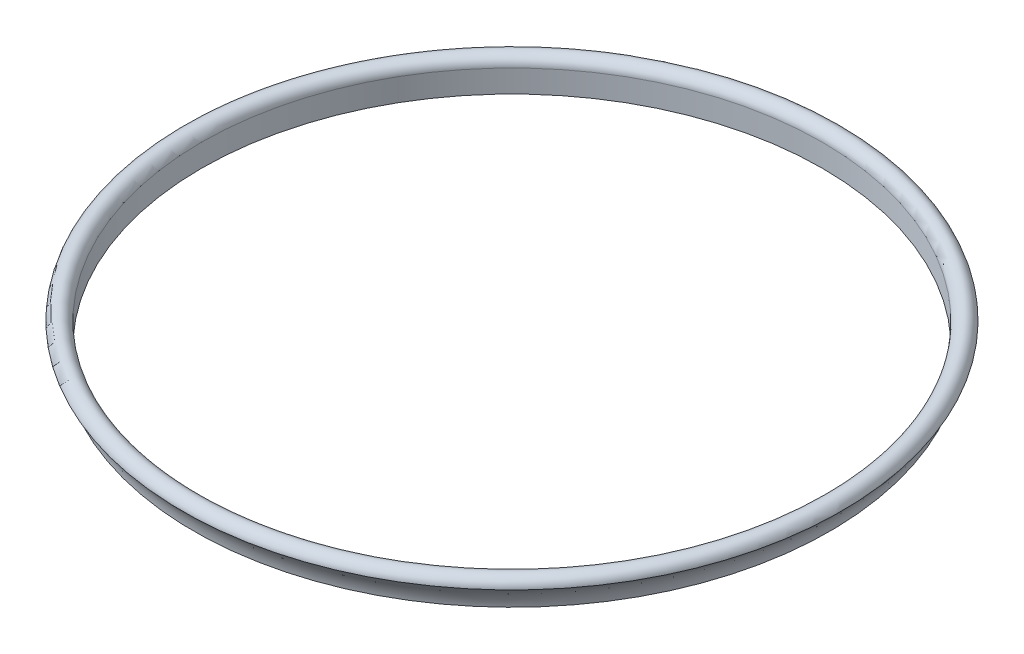
ISO-10303-21;
HEADER;
FILE_DESCRIPTION(('STEP AP214'),'2;1');
FILE_NAME('part.step','',(''),(''),'','','');
FILE_SCHEMA(('AUTOMOTIVE_DESIGN { 1 0 10303 214 1 1 1 1 }'));
ENDSEC;
DATA;
#1=APPLICATION_CONTEXT('core data for automotive mechanical design processes');
#2=APPLICATION_PROTOCOL_DEFINITION('international standard','automotive_design',2000,#1);
#3=PRODUCT_CONTEXT('',#1,'mechanical');
#4=PRODUCT('Part','Part','',(#3));
#5=PRODUCT_RELATED_PRODUCT_CATEGORY('part','',(#4));
#6=PRODUCT_DEFINITION_FORMATION('','',#4);
#7=PRODUCT_DEFINITION_CONTEXT('part definition',#1,'design');
#8=PRODUCT_DEFINITION('design','',#6,#7);
#9=PRODUCT_DEFINITION_SHAPE('','',#8);
#10=(LENGTH_UNIT() NAMED_UNIT(*) SI_UNIT(.MILLI.,.METRE.));
#11=(NAMED_UNIT(*) PLANE_ANGLE_UNIT() SI_UNIT($,.RADIAN.));
#12=(NAMED_UNIT(*) SI_UNIT($,.STERADIAN.) SOLID_ANGLE_UNIT());
#13=UNCERTAINTY_MEASURE_WITH_UNIT(LENGTH_MEASURE(1.E-05),#10,'distance_accuracy_value','');
#14=(GEOMETRIC_REPRESENTATION_CONTEXT(3) GLOBAL_UNCERTAINTY_ASSIGNED_CONTEXT((#13)) GLOBAL_UNIT_ASSIGNED_CONTEXT((#10,
#11,#12)) REPRESENTATION_CONTEXT('',''));
#15=CARTESIAN_POINT('',(0.,0.,0.));
#16=DIRECTION('',(0.,0.,1.));
#17=DIRECTION('',(1.,0.,0.));
#18=AXIS2_PLACEMENT_3D('',#15,#16,#17);
#19=CARTESIAN_POINT('',(84.582,0.,0.));
#20=DIRECTION('',(0.,-1.,0.));
#21=DIRECTION('',(0.,0.,-1.));
#22=AXIS2_PLACEMENT_3D('',#19,#20,#21);
#23=PLANE('',#22);
#24=CARTESIAN_POINT('',(0.,0.,0.));
#25=DIRECTION('',(0.,-1.,0.));
#26=DIRECTION('',(0.,0.,-1.));
#27=AXIS2_PLACEMENT_3D('',#24,#25,#26);
#28=CIRCLE('',#27,84.582);
#29=CARTESIAN_POINT('',(0.,0.,-84.582));
#30=VERTEX_POINT('',#29);
#31=EDGE_CURVE('E48',#30,#30,#28,.T.);
#32=ORIENTED_EDGE('',*,*,#31,.T.);
#33=EDGE_LOOP('',(#32));
#34=FACE_BOUND('',#33,.T.);
#35=CARTESIAN_POINT('',(0.,0.,0.));
#36=DIRECTION('',(0.,-1.,0.));
#37=DIRECTION('',(0.,0.,-1.));
#38=AXIS2_PLACEMENT_3D('',#35,#36,#37);
#39=CIRCLE('',#38,82.55);
#40=CARTESIAN_POINT('',(0.,0.,-82.55));
#41=VERTEX_POINT('',#40);
#42=EDGE_CURVE('E10',#41,#41,#39,.T.);
#43=ORIENTED_EDGE('',*,*,#42,.F.);
#44=EDGE_LOOP('',(#43));
#45=FACE_BOUND('',#44,.T.);
#46=ADVANCED_FACE('F34',(#34,#45),#23,.T.);
#47=CARTESIAN_POINT('',(0.,0.,0.));
#48=DIRECTION('',(0.,-1.,0.));
#49=DIRECTION('',(0.,0.,-1.));
#50=AXIS2_PLACEMENT_3D('',#47,#48,#49);
#51=CYLINDRICAL_SURFACE('',#50,82.55);
#52=ORIENTED_EDGE('',*,*,#42,.T.);
#53=EDGE_LOOP('',(#52));
#54=FACE_BOUND('',#53,.T.);
#55=CARTESIAN_POINT('',(0.,6.,0.));
#56=DIRECTION('',(0.,-1.,0.));
#57=DIRECTION('',(0.,0.,-1.));
#58=AXIS2_PLACEMENT_3D('',#55,#56,#57);
#59=CIRCLE('',#58,82.55);
#60=CARTESIAN_POINT('',(0.,6.,-82.55));
#61=VERTEX_POINT('',#60);
#62=EDGE_CURVE('E40',#61,#61,#59,.T.);
#63=ORIENTED_EDGE('',*,*,#62,.F.);
#64=EDGE_LOOP('',(#63));
#65=FACE_BOUND('',#64,.T.);
#66=ADVANCED_FACE('F64',(#54,#65),#51,.F.);
#67=CARTESIAN_POINT('',(0.,6.,0.));
#68=DIRECTION('',(0.,-1.,0.));
#69=DIRECTION('',(0.,0.,-1.));
#70=AXIS2_PLACEMENT_3D('',#67,#68,#69);
#71=TOROIDAL_SURFACE('',#70,85.09,2.54);
#72=ORIENTED_EDGE('',*,*,#62,.T.);
#73=EDGE_LOOP('',(#72));
#74=FACE_BOUND('',#73,.T.);
#75=CARTESIAN_POINT('',(0.,6.13828574609856,0.));
#76=DIRECTION('',(0.,-1.,0.));
#77=DIRECTION('',(0.,0.,-1.));
#78=AXIS2_PLACEMENT_3D('',#75,#76,#77);
#79=CIRCLE('',#78,87.6262328466499);
#80=CARTESIAN_POINT('',(0.,6.13828574609856,-87.6262328466499));
#81=VERTEX_POINT('',#80);
#82=EDGE_CURVE('E44',#81,#81,#79,.T.);
#83=ORIENTED_EDGE('',*,*,#82,.F.);
#84=EDGE_LOOP('',(#83));
#85=FACE_BOUND('',#84,.T.);
#86=ADVANCED_FACE('F58',(#74,#85),#71,.T.);
#87=CARTESIAN_POINT('',(0.,-1.10502237416679,0.));
#88=DIRECTION('',(0.,-1.,0.));
#89=DIRECTION('',(0.,0.,-1.));
#90=AXIS2_PLACEMENT_3D('',#87,#88,#89);
#91=TOROIDAL_SURFACE('',#90,94.5207587531135,10.);
#92=ORIENTED_EDGE('',*,*,#82,.T.);
#93=EDGE_LOOP('',(#92));
#94=FACE_BOUND('',#93,.T.);
#95=ORIENTED_EDGE('',*,*,#31,.F.);
#96=EDGE_LOOP('',(#95));
#97=FACE_BOUND('',#96,.T.);
#98=ADVANCED_FACE('F56',(#94,#97),#91,.F.);
#99=CLOSED_SHELL('',(#46,#66,#86,#98));
#100=MANIFOLD_SOLID_BREP('B2',#99);
#101=ADVANCED_BREP_SHAPE_REPRESENTATION('',(#18,#100),#14);
#102=SHAPE_DEFINITION_REPRESENTATION(#9,#101);
ENDSEC;
END-ISO-10303-21;
